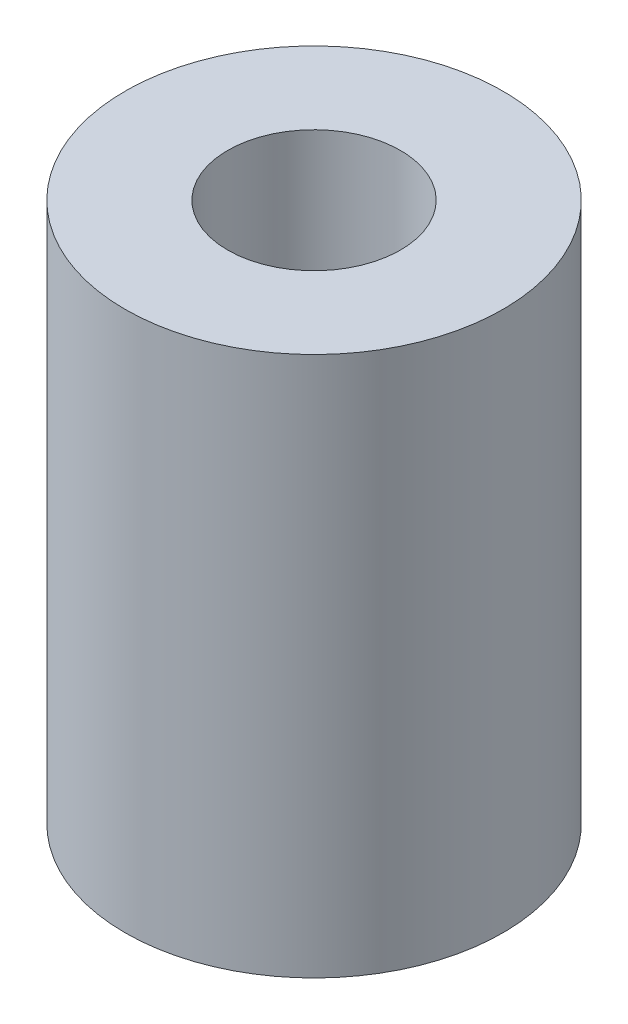
ISO-10303-21;
HEADER;
FILE_DESCRIPTION(('STEP AP214'),'2;1');
FILE_NAME('part.step','',(''),(''),'','','');
FILE_SCHEMA(('AUTOMOTIVE_DESIGN { 1 0 10303 214 1 1 1 1 }'));
ENDSEC;
DATA;
#1=APPLICATION_CONTEXT('core data for automotive mechanical design processes');
#2=APPLICATION_PROTOCOL_DEFINITION('international standard','automotive_design',2000,#1);
#3=PRODUCT_CONTEXT('',#1,'mechanical');
#4=PRODUCT('Part','Part','',(#3));
#5=PRODUCT_RELATED_PRODUCT_CATEGORY('part','',(#4));
#6=PRODUCT_DEFINITION_FORMATION('','',#4);
#7=PRODUCT_DEFINITION_CONTEXT('part definition',#1,'design');
#8=PRODUCT_DEFINITION('design','',#6,#7);
#9=PRODUCT_DEFINITION_SHAPE('','',#8);
#10=(LENGTH_UNIT() NAMED_UNIT(*) SI_UNIT(.MILLI.,.METRE.));
#11=(NAMED_UNIT(*) PLANE_ANGLE_UNIT() SI_UNIT($,.RADIAN.));
#12=(NAMED_UNIT(*) SI_UNIT($,.STERADIAN.) SOLID_ANGLE_UNIT());
#13=UNCERTAINTY_MEASURE_WITH_UNIT(LENGTH_MEASURE(1.E-05),#10,'distance_accuracy_value','');
#14=(GEOMETRIC_REPRESENTATION_CONTEXT(3) GLOBAL_UNCERTAINTY_ASSIGNED_CONTEXT((#13)) GLOBAL_UNIT_ASSIGNED_CONTEXT((#10,
#11,#12)) REPRESENTATION_CONTEXT('',''));
#15=CARTESIAN_POINT('',(0.,0.,0.));
#16=DIRECTION('',(0.,0.,1.));
#17=DIRECTION('',(1.,0.,0.));
#18=AXIS2_PLACEMENT_3D('',#15,#16,#17);
#19=CARTESIAN_POINT('',(0.,5.,0.));
#20=DIRECTION('',(0.,1.,0.));
#21=DIRECTION('',(0.,0.,1.));
#22=AXIS2_PLACEMENT_3D('',#19,#20,#21);
#23=PLANE('',#22);
#24=CARTESIAN_POINT('',(0.,5.,0.));
#25=DIRECTION('',(0.,1.,0.));
#26=DIRECTION('',(0.,0.,1.));
#27=AXIS2_PLACEMENT_3D('',#24,#25,#26);
#28=CIRCLE('',#27,3.5);
#29=CARTESIAN_POINT('',(0.,5.,3.5));
#30=VERTEX_POINT('',#29);
#31=EDGE_CURVE('E10',#30,#30,#28,.T.);
#32=ORIENTED_EDGE('',*,*,#31,.T.);
#33=EDGE_LOOP('',(#32));
#34=FACE_BOUND('',#33,.T.);
#35=CARTESIAN_POINT('',(0.,5.,0.));
#36=DIRECTION('',(0.,1.,0.));
#37=DIRECTION('',(0.,0.,1.));
#38=AXIS2_PLACEMENT_3D('',#35,#36,#37);
#39=CIRCLE('',#38,1.6);
#40=CARTESIAN_POINT('',(0.,5.,1.6));
#41=VERTEX_POINT('',#40);
#42=EDGE_CURVE('E44',#41,#41,#39,.T.);
#43=ORIENTED_EDGE('',*,*,#42,.F.);
#44=EDGE_LOOP('',(#43));
#45=FACE_BOUND('',#44,.T.);
#46=ADVANCED_FACE('F33',(#34,#45),#23,.T.);
#47=CARTESIAN_POINT('',(0.,-5.,0.));
#48=DIRECTION('',(0.,1.,0.));
#49=DIRECTION('',(0.,0.,1.));
#50=AXIS2_PLACEMENT_3D('',#47,#48,#49);
#51=PLANE('',#50);
#52=CARTESIAN_POINT('',(0.,-5.,0.));
#53=DIRECTION('',(0.,1.,0.));
#54=DIRECTION('',(0.,0.,1.));
#55=AXIS2_PLACEMENT_3D('',#52,#53,#54);
#56=CIRCLE('',#55,3.5);
#57=CARTESIAN_POINT('',(0.,-5.,3.5));
#58=VERTEX_POINT('',#57);
#59=EDGE_CURVE('E37',#58,#58,#56,.T.);
#60=ORIENTED_EDGE('',*,*,#59,.F.);
#61=EDGE_LOOP('',(#60));
#62=FACE_BOUND('',#61,.T.);
#63=CARTESIAN_POINT('',(0.,-5.,0.));
#64=DIRECTION('',(0.,1.,0.));
#65=DIRECTION('',(0.,0.,1.));
#66=AXIS2_PLACEMENT_3D('',#63,#64,#65);
#67=CIRCLE('',#66,1.6);
#68=CARTESIAN_POINT('',(0.,-5.,1.6));
#69=VERTEX_POINT('',#68);
#70=EDGE_CURVE('E46',#69,#69,#67,.T.);
#71=ORIENTED_EDGE('',*,*,#70,.T.);
#72=EDGE_LOOP('',(#71));
#73=FACE_BOUND('',#72,.T.);
#74=ADVANCED_FACE('F56',(#62,#73),#51,.F.);
#75=CARTESIAN_POINT('',(0.,5.,0.));
#76=DIRECTION('',(0.,-1.,0.));
#77=DIRECTION('',(0.,0.,-1.));
#78=AXIS2_PLACEMENT_3D('',#75,#76,#77);
#79=CYLINDRICAL_SURFACE('',#78,3.5);
#80=ORIENTED_EDGE('',*,*,#31,.F.);
#81=EDGE_LOOP('',(#80));
#82=FACE_BOUND('',#81,.T.);
#83=ORIENTED_EDGE('',*,*,#59,.T.);
#84=EDGE_LOOP('',(#83));
#85=FACE_BOUND('',#84,.T.);
#86=ADVANCED_FACE('F35',(#82,#85),#79,.T.);
#87=CARTESIAN_POINT('',(0.,5.,0.));
#88=DIRECTION('',(0.,-1.,0.));
#89=DIRECTION('',(0.,0.,-1.));
#90=AXIS2_PLACEMENT_3D('',#87,#88,#89);
#91=CYLINDRICAL_SURFACE('',#90,1.6);
#92=ORIENTED_EDGE('',*,*,#42,.T.);
#93=EDGE_LOOP('',(#92));
#94=FACE_BOUND('',#93,.T.);
#95=ORIENTED_EDGE('',*,*,#70,.F.);
#96=EDGE_LOOP('',(#95));
#97=FACE_BOUND('',#96,.T.);
#98=ADVANCED_FACE('F52',(#94,#97),#91,.F.);
#99=CLOSED_SHELL('',(#46,#74,#86,#98));
#100=MANIFOLD_SOLID_BREP('B2',#99);
#101=ADVANCED_BREP_SHAPE_REPRESENTATION('',(#18,#100),#14);
#102=SHAPE_DEFINITION_REPRESENTATION(#9,#101);
ENDSEC;
END-ISO-10303-21;
